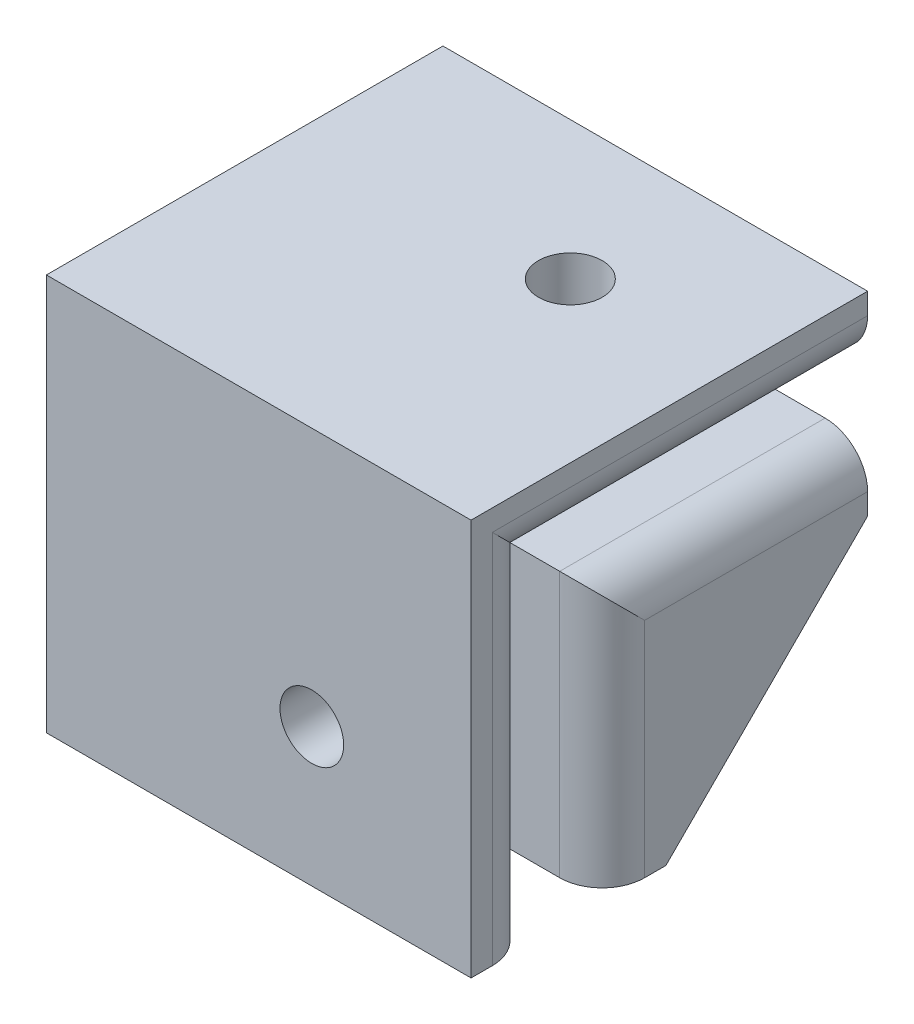
ISO-10303-21;
HEADER;
FILE_DESCRIPTION(('STEP AP214'),'2;1');
FILE_NAME('part.step','',(''),(''),'','','');
FILE_SCHEMA(('AUTOMOTIVE_DESIGN { 1 0 10303 214 1 1 1 1 }'));
ENDSEC;
DATA;
#1=APPLICATION_CONTEXT('core data for automotive mechanical design processes');
#2=APPLICATION_PROTOCOL_DEFINITION('international standard','automotive_design',2000,#1);
#3=PRODUCT_CONTEXT('',#1,'mechanical');
#4=PRODUCT('Part','Part','',(#3));
#5=PRODUCT_RELATED_PRODUCT_CATEGORY('part','',(#4));
#6=PRODUCT_DEFINITION_FORMATION('','',#4);
#7=PRODUCT_DEFINITION_CONTEXT('part definition',#1,'design');
#8=PRODUCT_DEFINITION('design','',#6,#7);
#9=PRODUCT_DEFINITION_SHAPE('','',#8);
#10=(LENGTH_UNIT() NAMED_UNIT(*) SI_UNIT(.MILLI.,.METRE.));
#11=(NAMED_UNIT(*) PLANE_ANGLE_UNIT() SI_UNIT($,.RADIAN.));
#12=(NAMED_UNIT(*) SI_UNIT($,.STERADIAN.) SOLID_ANGLE_UNIT());
#13=UNCERTAINTY_MEASURE_WITH_UNIT(LENGTH_MEASURE(1.E-05),#10,'distance_accuracy_value','');
#14=(GEOMETRIC_REPRESENTATION_CONTEXT(3) GLOBAL_UNCERTAINTY_ASSIGNED_CONTEXT((#13)) GLOBAL_UNIT_ASSIGNED_CONTEXT((#10,
#11,#12)) REPRESENTATION_CONTEXT('',''));
#15=CARTESIAN_POINT('',(0.,0.,0.));
#16=DIRECTION('',(0.,0.,1.));
#17=DIRECTION('',(1.,0.,0.));
#18=AXIS2_PLACEMENT_3D('',#15,#16,#17);
#19=CARTESIAN_POINT('',(12.5,-12.5,-6.));
#20=DIRECTION('',(0.,1.,0.));
#21=DIRECTION('',(0.,0.,1.));
#22=AXIS2_PLACEMENT_3D('',#19,#20,#21);
#23=CYLINDRICAL_SURFACE('',#22,1.5);
#24=CARTESIAN_POINT('',(12.5,0.,-6.));
#25=DIRECTION('',(0.,-1.,0.));
#26=DIRECTION('',(0.,0.,-1.));
#27=AXIS2_PLACEMENT_3D('',#24,#25,#26);
#28=CIRCLE('',#27,1.5);
#29=CARTESIAN_POINT('',(12.5,0.,-7.5));
#30=VERTEX_POINT('',#29);
#31=EDGE_CURVE('E165',#30,#30,#28,.T.);
#32=ORIENTED_EDGE('',*,*,#31,.F.);
#33=EDGE_LOOP('',(#32));
#34=FACE_BOUND('',#33,.T.);
#35=CARTESIAN_POINT('',(12.5,-6.,-6.));
#36=DIRECTION('',(0.,0.707106781186548,-0.707106781186547));
#37=DIRECTION('',(0.,0.707106781186547,0.707106781186548));
#38=AXIS2_PLACEMENT_3D('',#35,#36,#37);
#39=ELLIPSE('',#38,2.12132034355964,1.5);
#40=CARTESIAN_POINT('',(14.,-6.,-6.));
#41=VERTEX_POINT('',#40);
#42=CARTESIAN_POINT('',(11.,-6.,-6.));
#43=VERTEX_POINT('',#42);
#44=EDGE_CURVE('E52',#41,#43,#39,.F.);
#45=ORIENTED_EDGE('',*,*,#44,.T.);
#46=CARTESIAN_POINT('',(12.5,-6.,-6.));
#47=DIRECTION('',(0.,0.707106781186547,0.707106781186548));
#48=DIRECTION('',(0.,0.707106781186548,-0.707106781186547));
#49=AXIS2_PLACEMENT_3D('',#46,#47,#48);
#50=ELLIPSE('',#49,2.12132034355964,1.5);
#51=EDGE_CURVE('E11',#43,#41,#50,.F.);
#52=ORIENTED_EDGE('',*,*,#51,.T.);
#53=EDGE_LOOP('',(#45,#52));
#54=FACE_BOUND('',#53,.T.);
#55=ADVANCED_FACE('F38',(#34,#54),#23,.F.);
#56=CARTESIAN_POINT('',(20.,0.,0.));
#57=DIRECTION('',(1.,0.,0.));
#58=DIRECTION('',(0.,0.,-1.));
#59=AXIS2_PLACEMENT_3D('',#56,#57,#58);
#60=PLANE('',#59);
#61=DIRECTION('',(0.,0.,-1.));
#62=VECTOR('',#61,1.);
#63=CARTESIAN_POINT('',(20.,-12.5,0.));
#64=LINE('',#63,#62);
#65=CARTESIAN_POINT('',(20.,-12.5,6.175));
#66=VERTEX_POINT('',#65);
#67=CARTESIAN_POINT('',(20.,-12.5,5.175));
#68=VERTEX_POINT('',#67);
#69=EDGE_CURVE('E270',#66,#68,#64,.T.);
#70=ORIENTED_EDGE('',*,*,#69,.T.);
#71=DIRECTION('',(0.,-1.,0.));
#72=VECTOR('',#71,1.);
#73=CARTESIAN_POINT('',(20.,3.175,5.175));
#74=LINE('',#73,#72);
#75=CARTESIAN_POINT('',(20.,5.175,5.175));
#76=VERTEX_POINT('',#75);
#77=EDGE_CURVE('E200',#68,#76,#74,.F.);
#78=ORIENTED_EDGE('',*,*,#77,.T.);
#79=DIRECTION('',(0.,0.,1.));
#80=VECTOR('',#79,1.);
#81=CARTESIAN_POINT('',(20.,5.175,-12.5));
#82=LINE('',#81,#80);
#83=CARTESIAN_POINT('',(20.,5.175,-12.5));
#84=VERTEX_POINT('',#83);
#85=EDGE_CURVE('E203',#76,#84,#82,.F.);
#86=ORIENTED_EDGE('',*,*,#85,.T.);
#87=DIRECTION('',(0.,1.,0.));
#88=VECTOR('',#87,1.);
#89=CARTESIAN_POINT('',(20.,-3.,-12.5));
#90=LINE('',#89,#88);
#91=CARTESIAN_POINT('',(20.,6.175,-12.5));
#92=VERTEX_POINT('',#91);
#93=EDGE_CURVE('E266',#84,#92,#90,.T.);
#94=ORIENTED_EDGE('',*,*,#93,.T.);
#95=DIRECTION('',(0.,0.,1.));
#96=VECTOR('',#95,1.);
#97=CARTESIAN_POINT('',(20.,6.175,-12.5));
#98=LINE('',#97,#96);
#99=CARTESIAN_POINT('',(20.,6.175,6.175));
#100=VERTEX_POINT('',#99);
#101=EDGE_CURVE('E259',#92,#100,#98,.T.);
#102=ORIENTED_EDGE('',*,*,#101,.T.);
#103=DIRECTION('',(0.,-1.,0.));
#104=VECTOR('',#103,1.);
#105=CARTESIAN_POINT('',(20.,6.175,6.175));
#106=LINE('',#105,#104);
#107=EDGE_CURVE('E236',#100,#66,#106,.T.);
#108=ORIENTED_EDGE('',*,*,#107,.T.);
#109=EDGE_LOOP('',(#70,#78,#86,#94,#102,#108));
#110=FACE_BOUND('',#109,.T.);
#111=ADVANCED_FACE('F364',(#110),#60,.T.);
#112=CARTESIAN_POINT('',(20.,-12.5,-3.));
#113=DIRECTION('',(0.,0.707106781186547,0.707106781186548));
#114=DIRECTION('',(0.,-0.707106781186548,0.707106781186547));
#115=AXIS2_PLACEMENT_3D('',#112,#113,#114);
#116=PLANE('',#115);
#117=CARTESIAN_POINT('',(12.5,-6.,-9.5));
#118=DIRECTION('',(0.,0.707106781186547,0.707106781186548));
#119=DIRECTION('',(0.,-0.707106781186548,0.707106781186547));
#120=AXIS2_PLACEMENT_3D('',#117,#118,#119);
#121=ELLIPSE('',#120,2.12132034355964,1.5);
#122=CARTESIAN_POINT('',(12.5,-7.5,-8.));
#123=VERTEX_POINT('',#122);
#124=EDGE_CURVE('E327',#123,#123,#121,.T.);
#125=ORIENTED_EDGE('',*,*,#124,.T.);
#126=EDGE_LOOP('',(#125));
#127=FACE_BOUND('',#126,.T.);
#128=CARTESIAN_POINT('',(12.5,-9.5,-6.));
#129=DIRECTION('',(0.,0.707106781186547,0.707106781186548));
#130=DIRECTION('',(0.,0.707106781186548,-0.707106781186547));
#131=AXIS2_PLACEMENT_3D('',#128,#129,#130);
#132=ELLIPSE('',#131,2.12132034355964,1.5);
#133=CARTESIAN_POINT('',(12.5,-8.,-7.5));
#134=VERTEX_POINT('',#133);
#135=EDGE_CURVE('E175',#134,#134,#132,.T.);
#136=ORIENTED_EDGE('',*,*,#135,.T.);
#137=EDGE_LOOP('',(#136));
#138=FACE_BOUND('',#137,.T.);
#139=DIRECTION('',(0.,0.707106781186548,-0.707106781186547));
#140=VECTOR('',#139,1.);
#141=CARTESIAN_POINT('',(0.,-12.5,-3.));
#142=LINE('',#141,#140);
#143=CARTESIAN_POINT('',(0.,-12.5,-3.));
#144=VERTEX_POINT('',#143);
#145=CARTESIAN_POINT('',(0.,-3.,-12.5));
#146=VERTEX_POINT('',#145);
#147=EDGE_CURVE('E251',#144,#146,#142,.T.);
#148=ORIENTED_EDGE('',*,*,#147,.T.);
#149=DIRECTION('',(-1.,0.,0.));
#150=VECTOR('',#149,1.);
#151=CARTESIAN_POINT('',(20.,-3.,-12.5));
#152=LINE('',#151,#150);
#153=CARTESIAN_POINT('',(20.,-3.,-12.5));
#154=VERTEX_POINT('',#153);
#155=EDGE_CURVE('E220',#154,#146,#152,.T.);
#156=ORIENTED_EDGE('',*,*,#155,.F.);
#157=DIRECTION('',(0.,0.707106781186548,-0.707106781186547));
#158=VECTOR('',#157,1.);
#159=CARTESIAN_POINT('',(20.,-12.5,-3.));
#160=LINE('',#159,#158);
#161=CARTESIAN_POINT('',(20.,-12.5,-3.));
#162=VERTEX_POINT('',#161);
#163=EDGE_CURVE('E267',#162,#154,#160,.T.);
#164=ORIENTED_EDGE('',*,*,#163,.F.);
#165=DIRECTION('',(-1.,0.,0.));
#166=VECTOR('',#165,1.);
#167=CARTESIAN_POINT('',(20.,-12.5,-3.));
#168=LINE('',#167,#166);
#169=EDGE_CURVE('E216',#162,#144,#168,.T.);
#170=ORIENTED_EDGE('',*,*,#169,.T.);
#171=EDGE_LOOP('',(#148,#156,#164,#170));
#172=FACE_BOUND('',#171,.T.);
#173=ADVANCED_FACE('F371',(#127,#138,#172),#116,.F.);
#174=CARTESIAN_POINT('',(20.,3.175,-12.5));
#175=DIRECTION('',(0.,0.,1.));
#176=DIRECTION('',(1.,0.,0.));
#177=AXIS2_PLACEMENT_3D('',#174,#175,#176);
#178=PLANE('',#177);
#179=DIRECTION('',(1.,0.,0.));
#180=VECTOR('',#179,1.);
#181=CARTESIAN_POINT('',(5.,0.,-12.5));
#182=LINE('',#181,#180);
#183=CARTESIAN_POINT('',(5.,0.,-12.5));
#184=VERTEX_POINT('',#183);
#185=CARTESIAN_POINT('',(18.,0.,-12.5));
#186=VERTEX_POINT('',#185);
#187=EDGE_CURVE('E287',#184,#186,#182,.T.);
#188=ORIENTED_EDGE('',*,*,#187,.T.);
#189=CARTESIAN_POINT('',(18.,-2.,-12.5));
#190=DIRECTION('',(0.,0.,1.));
#191=DIRECTION('',(1.,0.,0.));
#192=AXIS2_PLACEMENT_3D('',#189,#190,#191);
#193=CIRCLE('',#192,2.);
#194=CARTESIAN_POINT('',(20.,-2.,-12.5));
#195=VERTEX_POINT('',#194);
#196=EDGE_CURVE('E182',#186,#195,#193,.F.);
#197=ORIENTED_EDGE('',*,*,#196,.T.);
#198=EDGE_CURVE('E262',#154,#195,#90,.T.);
#199=ORIENTED_EDGE('',*,*,#198,.F.);
#200=ORIENTED_EDGE('',*,*,#155,.T.);
#201=DIRECTION('',(0.,1.,0.));
#202=VECTOR('',#201,1.);
#203=CARTESIAN_POINT('',(0.,3.175,-12.5));
#204=LINE('',#203,#202);
#205=CARTESIAN_POINT('',(0.,6.175,-12.5));
#206=VERTEX_POINT('',#205);
#207=EDGE_CURVE('E248',#146,#206,#204,.T.);
#208=ORIENTED_EDGE('',*,*,#207,.T.);
#209=DIRECTION('',(-1.,0.,0.));
#210=VECTOR('',#209,1.);
#211=CARTESIAN_POINT('',(20.,6.175,-12.5));
#212=LINE('',#211,#210);
#213=EDGE_CURVE('E224',#92,#206,#212,.T.);
#214=ORIENTED_EDGE('',*,*,#213,.F.);
#215=ORIENTED_EDGE('',*,*,#93,.F.);
#216=CARTESIAN_POINT('',(18.,5.175,-12.5));
#217=DIRECTION('',(0.,0.,1.));
#218=DIRECTION('',(1.,0.,0.));
#219=AXIS2_PLACEMENT_3D('',#216,#217,#218);
#220=CIRCLE('',#219,2.);
#221=CARTESIAN_POINT('',(18.,3.175,-12.5));
#222=VERTEX_POINT('',#221);
#223=EDGE_CURVE('E60',#84,#222,#220,.F.);
#224=ORIENTED_EDGE('',*,*,#223,.T.);
#225=DIRECTION('',(1.,0.,0.));
#226=VECTOR('',#225,1.);
#227=CARTESIAN_POINT('',(5.,3.175,-12.5));
#228=LINE('',#227,#226);
#229=CARTESIAN_POINT('',(5.,3.175,-12.5));
#230=VERTEX_POINT('',#229);
#231=EDGE_CURVE('E291',#230,#222,#228,.T.);
#232=ORIENTED_EDGE('',*,*,#231,.F.);
#233=DIRECTION('',(0.,1.,0.));
#234=VECTOR('',#233,1.);
#235=CARTESIAN_POINT('',(5.,0.,-12.5));
#236=LINE('',#235,#234);
#237=EDGE_CURVE('E300',#184,#230,#236,.T.);
#238=ORIENTED_EDGE('',*,*,#237,.F.);
#239=EDGE_LOOP('',(#188,#197,#199,#200,#208,#214,#215,#224,#232,#238));
#240=FACE_BOUND('',#239,.T.);
#241=ADVANCED_FACE('F374',(#240),#178,.F.);
#242=CARTESIAN_POINT('',(20.,6.175,-12.5));
#243=DIRECTION('',(0.,-1.,0.));
#244=DIRECTION('',(0.,0.,-1.));
#245=AXIS2_PLACEMENT_3D('',#242,#243,#244);
#246=PLANE('',#245);
#247=CARTESIAN_POINT('',(12.5,6.175,-6.));
#248=DIRECTION('',(0.,1.,0.));
#249=DIRECTION('',(0.,0.,1.));
#250=AXIS2_PLACEMENT_3D('',#247,#248,#249);
#251=CIRCLE('',#250,1.5);
#252=CARTESIAN_POINT('',(12.5,6.175,-4.5));
#253=VERTEX_POINT('',#252);
#254=EDGE_CURVE('E170',#253,#253,#251,.T.);
#255=ORIENTED_EDGE('',*,*,#254,.F.);
#256=EDGE_LOOP('',(#255));
#257=FACE_BOUND('',#256,.T.);
#258=DIRECTION('',(0.,0.,1.));
#259=VECTOR('',#258,1.);
#260=CARTESIAN_POINT('',(0.,6.175,-12.5));
#261=LINE('',#260,#259);
#262=CARTESIAN_POINT('',(0.,6.175,6.175));
#263=VERTEX_POINT('',#262);
#264=EDGE_CURVE('E245',#206,#263,#261,.T.);
#265=ORIENTED_EDGE('',*,*,#264,.T.);
#266=DIRECTION('',(-1.,0.,0.));
#267=VECTOR('',#266,1.);
#268=CARTESIAN_POINT('',(20.,6.175,6.175));
#269=LINE('',#268,#267);
#270=EDGE_CURVE('E228',#100,#263,#269,.T.);
#271=ORIENTED_EDGE('',*,*,#270,.F.);
#272=ORIENTED_EDGE('',*,*,#101,.F.);
#273=ORIENTED_EDGE('',*,*,#213,.T.);
#274=EDGE_LOOP('',(#265,#271,#272,#273));
#275=FACE_BOUND('',#274,.T.);
#276=ADVANCED_FACE('F351',(#257,#275),#246,.F.);
#277=CARTESIAN_POINT('',(20.,6.175,6.175));
#278=DIRECTION('',(0.,0.,-1.));
#279=DIRECTION('',(0.,1.,0.));
#280=AXIS2_PLACEMENT_3D('',#277,#278,#279);
#281=PLANE('',#280);
#282=CARTESIAN_POINT('',(12.5,-6.,6.175));
#283=DIRECTION('',(0.,0.,1.));
#284=DIRECTION('',(1.,0.,0.));
#285=AXIS2_PLACEMENT_3D('',#282,#283,#284);
#286=CIRCLE('',#285,1.5);
#287=CARTESIAN_POINT('',(14.,-6.,6.175));
#288=VERTEX_POINT('',#287);
#289=EDGE_CURVE('E339',#288,#288,#286,.T.);
#290=ORIENTED_EDGE('',*,*,#289,.F.);
#291=EDGE_LOOP('',(#290));
#292=FACE_BOUND('',#291,.T.);
#293=DIRECTION('',(0.,-1.,0.));
#294=VECTOR('',#293,1.);
#295=CARTESIAN_POINT('',(0.,6.175,6.175));
#296=LINE('',#295,#294);
#297=CARTESIAN_POINT('',(0.,-12.5,6.175));
#298=VERTEX_POINT('',#297);
#299=EDGE_CURVE('E241',#263,#298,#296,.T.);
#300=ORIENTED_EDGE('',*,*,#299,.T.);
#301=DIRECTION('',(-1.,0.,0.));
#302=VECTOR('',#301,1.);
#303=CARTESIAN_POINT('',(20.,-12.5,6.175));
#304=LINE('',#303,#302);
#305=EDGE_CURVE('E232',#66,#298,#304,.T.);
#306=ORIENTED_EDGE('',*,*,#305,.F.);
#307=ORIENTED_EDGE('',*,*,#107,.F.);
#308=ORIENTED_EDGE('',*,*,#270,.T.);
#309=EDGE_LOOP('',(#300,#306,#307,#308));
#310=FACE_BOUND('',#309,.T.);
#311=ADVANCED_FACE('F347',(#292,#310),#281,.F.);
#312=CARTESIAN_POINT('',(20.,-12.5,0.));
#313=DIRECTION('',(0.,1.,0.));
#314=DIRECTION('',(0.,0.,1.));
#315=AXIS2_PLACEMENT_3D('',#312,#313,#314);
#316=PLANE('',#315);
#317=DIRECTION('',(1.,0.,0.));
#318=VECTOR('',#317,1.);
#319=CARTESIAN_POINT('',(5.,-12.5,3.175));
#320=LINE('',#319,#318);
#321=CARTESIAN_POINT('',(5.,-12.5,3.175));
#322=VERTEX_POINT('',#321);
#323=CARTESIAN_POINT('',(18.,-12.5,3.175));
#324=VERTEX_POINT('',#323);
#325=EDGE_CURVE('E274',#322,#324,#320,.T.);
#326=ORIENTED_EDGE('',*,*,#325,.T.);
#327=CARTESIAN_POINT('',(18.,-12.5,5.175));
#328=DIRECTION('',(0.,1.,0.));
#329=DIRECTION('',(0.,0.,1.));
#330=AXIS2_PLACEMENT_3D('',#327,#328,#329);
#331=CIRCLE('',#330,2.);
#332=EDGE_CURVE('E206',#324,#68,#331,.F.);
#333=ORIENTED_EDGE('',*,*,#332,.T.);
#334=ORIENTED_EDGE('',*,*,#69,.F.);
#335=ORIENTED_EDGE('',*,*,#305,.T.);
#336=DIRECTION('',(0.,0.,-1.));
#337=VECTOR('',#336,1.);
#338=CARTESIAN_POINT('',(0.,-12.5,0.));
#339=LINE('',#338,#337);
#340=EDGE_CURVE('E237',#298,#144,#339,.T.);
#341=ORIENTED_EDGE('',*,*,#340,.T.);
#342=ORIENTED_EDGE('',*,*,#169,.F.);
#343=CARTESIAN_POINT('',(20.,-12.5,-2.));
#344=VERTEX_POINT('',#343);
#345=EDGE_CURVE('E240',#344,#162,#64,.T.);
#346=ORIENTED_EDGE('',*,*,#345,.F.);
#347=CARTESIAN_POINT('',(18.,-12.5,-2.));
#348=DIRECTION('',(0.,1.,0.));
#349=DIRECTION('',(0.,0.,1.));
#350=AXIS2_PLACEMENT_3D('',#347,#348,#349);
#351=CIRCLE('',#350,2.);
#352=CARTESIAN_POINT('',(18.,-12.5,0.));
#353=VERTEX_POINT('',#352);
#354=EDGE_CURVE('E209',#344,#353,#351,.F.);
#355=ORIENTED_EDGE('',*,*,#354,.T.);
#356=DIRECTION('',(1.,0.,0.));
#357=VECTOR('',#356,1.);
#358=CARTESIAN_POINT('',(5.,-12.5,0.));
#359=LINE('',#358,#357);
#360=CARTESIAN_POINT('',(5.,-12.5,0.));
#361=VERTEX_POINT('',#360);
#362=EDGE_CURVE('E278',#361,#353,#359,.T.);
#363=ORIENTED_EDGE('',*,*,#362,.F.);
#364=DIRECTION('',(0.,0.,-1.));
#365=VECTOR('',#364,1.);
#366=CARTESIAN_POINT('',(5.,-12.5,3.175));
#367=LINE('',#366,#365);
#368=EDGE_CURVE('E311',#322,#361,#367,.T.);
#369=ORIENTED_EDGE('',*,*,#368,.F.);
#370=EDGE_LOOP('',(#326,#333,#334,#335,#341,#342,#346,#355,#363,#369));
#371=FACE_BOUND('',#370,.T.);
#372=ADVANCED_FACE('F350',(#371),#316,.F.);
#373=DIRECTION('',(0.,0.,-1.));
#374=VECTOR('',#373,1.);
#375=CARTESIAN_POINT('',(20.,-2.,0.));
#376=LINE('',#375,#374);
#377=CARTESIAN_POINT('',(20.,-2.,-2.));
#378=VERTEX_POINT('',#377);
#379=EDGE_CURVE('E193',#195,#378,#376,.F.);
#380=ORIENTED_EDGE('',*,*,#379,.T.);
#381=DIRECTION('',(0.,1.,0.));
#382=VECTOR('',#381,1.);
#383=CARTESIAN_POINT('',(20.,-12.5,-2.));
#384=LINE('',#383,#382);
#385=EDGE_CURVE('E190',#378,#344,#384,.F.);
#386=ORIENTED_EDGE('',*,*,#385,.T.);
#387=ORIENTED_EDGE('',*,*,#345,.T.);
#388=ORIENTED_EDGE('',*,*,#163,.T.);
#389=ORIENTED_EDGE('',*,*,#198,.T.);
#390=EDGE_LOOP('',(#380,#386,#387,#388,#389));
#391=FACE_BOUND('',#390,.T.);
#392=ADVANCED_FACE('F378',(#391),#60,.T.);
#393=CARTESIAN_POINT('',(0.,0.,0.));
#394=DIRECTION('',(1.,0.,0.));
#395=DIRECTION('',(0.,0.,-1.));
#396=AXIS2_PLACEMENT_3D('',#393,#394,#395);
#397=PLANE('',#396);
#398=ORIENTED_EDGE('',*,*,#147,.F.);
#399=ORIENTED_EDGE('',*,*,#340,.F.);
#400=ORIENTED_EDGE('',*,*,#299,.F.);
#401=ORIENTED_EDGE('',*,*,#264,.F.);
#402=ORIENTED_EDGE('',*,*,#207,.F.);
#403=EDGE_LOOP('',(#398,#399,#400,#401,#402));
#404=FACE_BOUND('',#403,.T.);
#405=ADVANCED_FACE('F368',(#404),#397,.F.);
#406=CARTESIAN_POINT('',(5.,3.175,3.175));
#407=DIRECTION('',(0.,0.,1.));
#408=DIRECTION('',(0.,-1.,0.));
#409=AXIS2_PLACEMENT_3D('',#406,#407,#408);
#410=PLANE('',#409);
#411=CARTESIAN_POINT('',(12.5,-6.,3.175));
#412=DIRECTION('',(0.,0.,1.));
#413=DIRECTION('',(0.,-1.,0.));
#414=AXIS2_PLACEMENT_3D('',#411,#412,#413);
#415=CIRCLE('',#414,1.5);
#416=CARTESIAN_POINT('',(12.5,-7.5,3.175));
#417=VERTEX_POINT('',#416);
#418=EDGE_CURVE('E331',#417,#417,#415,.T.);
#419=ORIENTED_EDGE('',*,*,#418,.T.);
#420=EDGE_LOOP('',(#419));
#421=FACE_BOUND('',#420,.T.);
#422=DIRECTION('',(1.,0.,0.));
#423=VECTOR('',#422,1.);
#424=CARTESIAN_POINT('',(5.,3.175,3.175));
#425=LINE('',#424,#423);
#426=CARTESIAN_POINT('',(5.,3.175,3.175));
#427=VERTEX_POINT('',#426);
#428=CARTESIAN_POINT('',(18.,3.175,3.175));
#429=VERTEX_POINT('',#428);
#430=EDGE_CURVE('E255',#427,#429,#425,.T.);
#431=ORIENTED_EDGE('',*,*,#430,.T.);
#432=DIRECTION('',(0.,-1.,0.));
#433=VECTOR('',#432,1.);
#434=CARTESIAN_POINT('',(18.,-12.5,3.175));
#435=LINE('',#434,#433);
#436=EDGE_CURVE('E212',#429,#324,#435,.T.);
#437=ORIENTED_EDGE('',*,*,#436,.T.);
#438=ORIENTED_EDGE('',*,*,#325,.F.);
#439=DIRECTION('',(0.,-1.,0.));
#440=VECTOR('',#439,1.);
#441=CARTESIAN_POINT('',(5.,3.175,3.175));
#442=LINE('',#441,#440);
#443=EDGE_CURVE('E179',#427,#322,#442,.T.);
#444=ORIENTED_EDGE('',*,*,#443,.F.);
#445=EDGE_LOOP('',(#431,#437,#438,#444));
#446=FACE_BOUND('',#445,.T.);
#447=ADVANCED_FACE('F399',(#421,#446),#410,.F.);
#448=CARTESIAN_POINT('',(5.,3.175,-12.5));
#449=DIRECTION('',(0.,1.,0.));
#450=DIRECTION('',(0.,0.,1.));
#451=AXIS2_PLACEMENT_3D('',#448,#449,#450);
#452=PLANE('',#451);
#453=CARTESIAN_POINT('',(12.5,3.175,-6.));
#454=DIRECTION('',(0.,1.,0.));
#455=DIRECTION('',(0.,0.,1.));
#456=AXIS2_PLACEMENT_3D('',#453,#454,#455);
#457=CIRCLE('',#456,1.5);
#458=CARTESIAN_POINT('',(12.5,3.175,-4.5));
#459=VERTEX_POINT('',#458);
#460=EDGE_CURVE('E169',#459,#459,#457,.T.);
#461=ORIENTED_EDGE('',*,*,#460,.T.);
#462=EDGE_LOOP('',(#461));
#463=FACE_BOUND('',#462,.T.);
#464=ORIENTED_EDGE('',*,*,#231,.T.);
#465=DIRECTION('',(0.,0.,1.));
#466=VECTOR('',#465,1.);
#467=CARTESIAN_POINT('',(18.,3.175,3.175));
#468=LINE('',#467,#466);
#469=EDGE_CURVE('E159',#222,#429,#468,.T.);
#470=ORIENTED_EDGE('',*,*,#469,.T.);
#471=ORIENTED_EDGE('',*,*,#430,.F.);
#472=DIRECTION('',(0.,0.,1.));
#473=VECTOR('',#472,1.);
#474=CARTESIAN_POINT('',(5.,3.175,-12.5));
#475=LINE('',#474,#473);
#476=EDGE_CURVE('E279',#230,#427,#475,.T.);
#477=ORIENTED_EDGE('',*,*,#476,.F.);
#478=EDGE_LOOP('',(#464,#470,#471,#477));
#479=FACE_BOUND('',#478,.T.);
#480=ADVANCED_FACE('F409',(#463,#479),#452,.F.);
#481=CARTESIAN_POINT('',(5.,0.,0.));
#482=DIRECTION('',(0.,-1.,0.));
#483=DIRECTION('',(0.,0.,-1.));
#484=AXIS2_PLACEMENT_3D('',#481,#482,#483);
#485=PLANE('',#484);
#486=ORIENTED_EDGE('',*,*,#31,.T.);
#487=EDGE_LOOP('',(#486));
#488=FACE_BOUND('',#487,.T.);
#489=DIRECTION('',(1.,0.,0.));
#490=VECTOR('',#489,1.);
#491=CARTESIAN_POINT('',(5.,0.,0.));
#492=LINE('',#491,#490);
#493=CARTESIAN_POINT('',(5.,0.,0.));
#494=VERTEX_POINT('',#493);
#495=CARTESIAN_POINT('',(18.,0.,0.));
#496=VERTEX_POINT('',#495);
#497=EDGE_CURVE('E283',#494,#496,#492,.T.);
#498=ORIENTED_EDGE('',*,*,#497,.T.);
#499=DIRECTION('',(0.,0.,-1.));
#500=VECTOR('',#499,1.);
#501=CARTESIAN_POINT('',(18.,0.,-12.5));
#502=LINE('',#501,#500);
#503=EDGE_CURVE('E187',#496,#186,#502,.T.);
#504=ORIENTED_EDGE('',*,*,#503,.T.);
#505=ORIENTED_EDGE('',*,*,#187,.F.);
#506=DIRECTION('',(0.,0.,-1.));
#507=VECTOR('',#506,1.);
#508=CARTESIAN_POINT('',(5.,0.,0.));
#509=LINE('',#508,#507);
#510=EDGE_CURVE('E303',#494,#184,#509,.T.);
#511=ORIENTED_EDGE('',*,*,#510,.F.);
#512=EDGE_LOOP('',(#498,#504,#505,#511));
#513=FACE_BOUND('',#512,.T.);
#514=ADVANCED_FACE('F413',(#488,#513),#485,.F.);
#515=CARTESIAN_POINT('',(5.,-12.5,0.));
#516=DIRECTION('',(0.,0.,-1.));
#517=DIRECTION('',(0.,1.,0.));
#518=AXIS2_PLACEMENT_3D('',#515,#516,#517);
#519=PLANE('',#518);
#520=CARTESIAN_POINT('',(12.5,-6.,0.));
#521=DIRECTION('',(0.,0.,-1.));
#522=DIRECTION('',(0.,1.,0.));
#523=AXIS2_PLACEMENT_3D('',#520,#521,#522);
#524=CIRCLE('',#523,1.5);
#525=CARTESIAN_POINT('',(12.5,-4.5,0.));
#526=VERTEX_POINT('',#525);
#527=EDGE_CURVE('E335',#526,#526,#524,.T.);
#528=ORIENTED_EDGE('',*,*,#527,.T.);
#529=EDGE_LOOP('',(#528));
#530=FACE_BOUND('',#529,.T.);
#531=ORIENTED_EDGE('',*,*,#362,.T.);
#532=DIRECTION('',(0.,1.,0.));
#533=VECTOR('',#532,1.);
#534=CARTESIAN_POINT('',(18.,0.,0.));
#535=LINE('',#534,#533);
#536=EDGE_CURVE('E196',#353,#496,#535,.T.);
#537=ORIENTED_EDGE('',*,*,#536,.T.);
#538=ORIENTED_EDGE('',*,*,#497,.F.);
#539=DIRECTION('',(0.,1.,0.));
#540=VECTOR('',#539,1.);
#541=CARTESIAN_POINT('',(5.,-12.5,0.));
#542=LINE('',#541,#540);
#543=EDGE_CURVE('E307',#361,#494,#542,.T.);
#544=ORIENTED_EDGE('',*,*,#543,.F.);
#545=EDGE_LOOP('',(#531,#537,#538,#544));
#546=FACE_BOUND('',#545,.T.);
#547=ADVANCED_FACE('F393',(#530,#546),#519,.F.);
#548=CARTESIAN_POINT('',(5.,0.,0.));
#549=DIRECTION('',(1.,0.,0.));
#550=DIRECTION('',(0.,0.,-1.));
#551=AXIS2_PLACEMENT_3D('',#548,#549,#550);
#552=PLANE('',#551);
#553=ORIENTED_EDGE('',*,*,#443,.T.);
#554=ORIENTED_EDGE('',*,*,#368,.T.);
#555=ORIENTED_EDGE('',*,*,#543,.T.);
#556=ORIENTED_EDGE('',*,*,#510,.T.);
#557=ORIENTED_EDGE('',*,*,#237,.T.);
#558=ORIENTED_EDGE('',*,*,#476,.T.);
#559=EDGE_LOOP('',(#553,#554,#555,#556,#557,#558));
#560=FACE_BOUND('',#559,.T.);
#561=ADVANCED_FACE('F396',(#560),#552,.T.);
#562=CARTESIAN_POINT('',(18.,5.175,-12.5));
#563=DIRECTION('',(0.,0.,-1.));
#564=DIRECTION('',(-1.,0.,0.));
#565=AXIS2_PLACEMENT_3D('',#562,#563,#564);
#566=CYLINDRICAL_SURFACE('',#565,2.);
#567=ORIENTED_EDGE('',*,*,#223,.F.);
#568=ORIENTED_EDGE('',*,*,#85,.F.);
#569=CARTESIAN_POINT('',(18.,5.175,5.175));
#570=DIRECTION('',(0.,0.707106781186547,-0.707106781186547));
#571=DIRECTION('',(0.,0.707106781186547,0.707106781186547));
#572=AXIS2_PLACEMENT_3D('',#569,#570,#571);
#573=ELLIPSE('',#572,2.82842712474619,2.);
#574=EDGE_CURVE('E174',#429,#76,#573,.F.);
#575=ORIENTED_EDGE('',*,*,#574,.F.);
#576=ORIENTED_EDGE('',*,*,#469,.F.);
#577=EDGE_LOOP('',(#567,#568,#575,#576));
#578=FACE_BOUND('',#577,.T.);
#579=ADVANCED_FACE('F406',(#578),#566,.T.);
#580=CARTESIAN_POINT('',(18.,3.175,5.175));
#581=DIRECTION('',(0.,1.,0.));
#582=DIRECTION('',(0.,0.,1.));
#583=AXIS2_PLACEMENT_3D('',#580,#581,#582);
#584=CYLINDRICAL_SURFACE('',#583,2.);
#585=ORIENTED_EDGE('',*,*,#574,.T.);
#586=ORIENTED_EDGE('',*,*,#77,.F.);
#587=ORIENTED_EDGE('',*,*,#332,.F.);
#588=ORIENTED_EDGE('',*,*,#436,.F.);
#589=EDGE_LOOP('',(#585,#586,#587,#588));
#590=FACE_BOUND('',#589,.T.);
#591=ADVANCED_FACE('F403',(#590),#584,.T.);
#592=CARTESIAN_POINT('',(18.,-2.,0.));
#593=DIRECTION('',(0.,0.,1.));
#594=DIRECTION('',(0.,-1.,0.));
#595=AXIS2_PLACEMENT_3D('',#592,#593,#594);
#596=CYLINDRICAL_SURFACE('',#595,2.);
#597=ORIENTED_EDGE('',*,*,#196,.F.);
#598=ORIENTED_EDGE('',*,*,#503,.F.);
#599=CARTESIAN_POINT('',(18.,-2.,-2.));
#600=DIRECTION('',(0.,-0.707106781186548,0.707106781186547));
#601=DIRECTION('',(0.,0.707106781186547,0.707106781186548));
#602=AXIS2_PLACEMENT_3D('',#599,#600,#601);
#603=ELLIPSE('',#602,2.82842712474619,2.);
#604=EDGE_CURVE('E171',#378,#496,#603,.T.);
#605=ORIENTED_EDGE('',*,*,#604,.F.);
#606=ORIENTED_EDGE('',*,*,#379,.F.);
#607=EDGE_LOOP('',(#597,#598,#605,#606));
#608=FACE_BOUND('',#607,.T.);
#609=ADVANCED_FACE('F40',(#608),#596,.T.);
#610=CARTESIAN_POINT('',(18.,-12.5,-2.));
#611=DIRECTION('',(0.,-1.,0.));
#612=DIRECTION('',(0.,0.,-1.));
#613=AXIS2_PLACEMENT_3D('',#610,#611,#612);
#614=CYLINDRICAL_SURFACE('',#613,2.);
#615=ORIENTED_EDGE('',*,*,#354,.F.);
#616=ORIENTED_EDGE('',*,*,#385,.F.);
#617=ORIENTED_EDGE('',*,*,#604,.T.);
#618=ORIENTED_EDGE('',*,*,#536,.F.);
#619=EDGE_LOOP('',(#615,#616,#617,#618));
#620=FACE_BOUND('',#619,.T.);
#621=ADVANCED_FACE('F386',(#620),#614,.T.);
#622=CARTESIAN_POINT('',(12.5,-6.,-6.));
#623=DIRECTION('',(0.,0.707106781186548,-0.707106781186547));
#624=DIRECTION('',(0.,0.707106781186547,0.707106781186548));
#625=AXIS2_PLACEMENT_3D('',#622,#623,#624);
#626=ELLIPSE('',#625,2.12132034355964,1.5);
#627=EDGE_CURVE('E148',#41,#43,#626,.T.);
#628=ORIENTED_EDGE('',*,*,#627,.T.);
#629=CARTESIAN_POINT('',(12.5,-6.,-6.));
#630=DIRECTION('',(0.,0.707106781186547,0.707106781186548));
#631=DIRECTION('',(0.,0.707106781186548,-0.707106781186547));
#632=AXIS2_PLACEMENT_3D('',#629,#630,#631);
#633=ELLIPSE('',#632,2.12132034355964,1.5);
#634=EDGE_CURVE('E47',#43,#41,#633,.T.);
#635=ORIENTED_EDGE('',*,*,#634,.T.);
#636=EDGE_LOOP('',(#628,#635));
#637=FACE_BOUND('',#636,.T.);
#638=ORIENTED_EDGE('',*,*,#135,.F.);
#639=EDGE_LOOP('',(#638));
#640=FACE_BOUND('',#639,.T.);
#641=ADVANCED_FACE('F161',(#637,#640),#23,.F.);
#642=ORIENTED_EDGE('',*,*,#254,.T.);
#643=EDGE_LOOP('',(#642));
#644=FACE_BOUND('',#643,.T.);
#645=ORIENTED_EDGE('',*,*,#460,.F.);
#646=EDGE_LOOP('',(#645));
#647=FACE_BOUND('',#646,.T.);
#648=ADVANCED_FACE('F428',(#644,#647),#23,.F.);
#649=CARTESIAN_POINT('',(12.5,-6.,-12.5));
#650=DIRECTION('',(0.,0.,1.));
#651=DIRECTION('',(1.,0.,0.));
#652=AXIS2_PLACEMENT_3D('',#649,#650,#651);
#653=CYLINDRICAL_SURFACE('',#652,1.5);
#654=ORIENTED_EDGE('',*,*,#44,.F.);
#655=ORIENTED_EDGE('',*,*,#634,.F.);
#656=EDGE_LOOP('',(#654,#655));
#657=FACE_BOUND('',#656,.T.);
#658=ORIENTED_EDGE('',*,*,#527,.F.);
#659=EDGE_LOOP('',(#658));
#660=FACE_BOUND('',#659,.T.);
#661=ADVANCED_FACE('F156',(#657,#660),#653,.F.);
#662=ORIENTED_EDGE('',*,*,#627,.F.);
#663=ORIENTED_EDGE('',*,*,#51,.F.);
#664=EDGE_LOOP('',(#662,#663));
#665=FACE_BOUND('',#664,.T.);
#666=ORIENTED_EDGE('',*,*,#124,.F.);
#667=EDGE_LOOP('',(#666));
#668=FACE_BOUND('',#667,.T.);
#669=ADVANCED_FACE('F149',(#665,#668),#653,.F.);
#670=ORIENTED_EDGE('',*,*,#289,.T.);
#671=EDGE_LOOP('',(#670));
#672=FACE_BOUND('',#671,.T.);
#673=ORIENTED_EDGE('',*,*,#418,.F.);
#674=EDGE_LOOP('',(#673));
#675=FACE_BOUND('',#674,.T.);
#676=ADVANCED_FACE('F344',(#672,#675),#653,.F.);
#677=CLOSED_SHELL('',(#55,#111,#173,#241,#276,#311,#372,#392,#405,#447,#480,#514,#547,#561,#579,
#591,#609,#621,#641,#648,#661,#669,#676));
#678=MANIFOLD_SOLID_BREP('B2',#677);
#679=ADVANCED_BREP_SHAPE_REPRESENTATION('',(#18,#678),#14);
#680=SHAPE_DEFINITION_REPRESENTATION(#9,#679);
ENDSEC;
END-ISO-10303-21;
